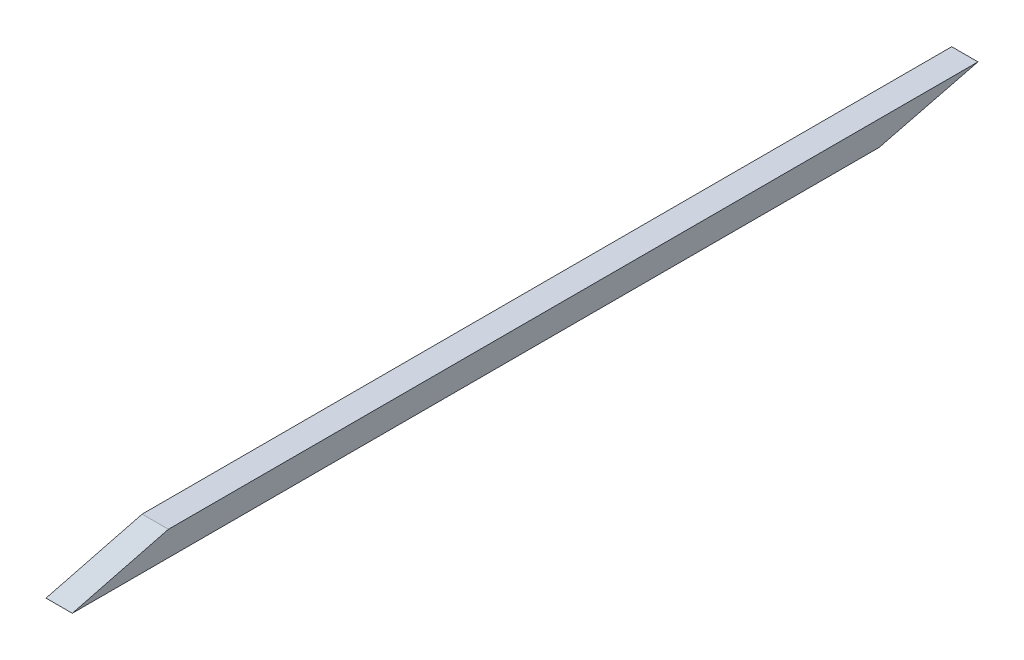
ISO-10303-21;
HEADER;
FILE_DESCRIPTION(('STEP AP214'),'2;1');
FILE_NAME('part.step','',(''),(''),'','','');
FILE_SCHEMA(('AUTOMOTIVE_DESIGN { 1 0 10303 214 1 1 1 1 }'));
ENDSEC;
DATA;
#1=APPLICATION_CONTEXT('core data for automotive mechanical design processes');
#2=APPLICATION_PROTOCOL_DEFINITION('international standard','automotive_design',2000,#1);
#3=PRODUCT_CONTEXT('',#1,'mechanical');
#4=PRODUCT('Part','Part','',(#3));
#5=PRODUCT_RELATED_PRODUCT_CATEGORY('part','',(#4));
#6=PRODUCT_DEFINITION_FORMATION('','',#4);
#7=PRODUCT_DEFINITION_CONTEXT('part definition',#1,'design');
#8=PRODUCT_DEFINITION('design','',#6,#7);
#9=PRODUCT_DEFINITION_SHAPE('','',#8);
#10=(LENGTH_UNIT() NAMED_UNIT(*) SI_UNIT(.MILLI.,.METRE.));
#11=(NAMED_UNIT(*) PLANE_ANGLE_UNIT() SI_UNIT($,.RADIAN.));
#12=(NAMED_UNIT(*) SI_UNIT($,.STERADIAN.) SOLID_ANGLE_UNIT());
#13=UNCERTAINTY_MEASURE_WITH_UNIT(LENGTH_MEASURE(1.E-05),#10,'distance_accuracy_value','');
#14=(GEOMETRIC_REPRESENTATION_CONTEXT(3) GLOBAL_UNCERTAINTY_ASSIGNED_CONTEXT((#13)) GLOBAL_UNIT_ASSIGNED_CONTEXT((#10,
#11,#12)) REPRESENTATION_CONTEXT('',''));
#15=CARTESIAN_POINT('',(0.,0.,0.));
#16=DIRECTION('',(0.,0.,1.));
#17=DIRECTION('',(1.,0.,0.));
#18=AXIS2_PLACEMENT_3D('',#15,#16,#17);
#19=CARTESIAN_POINT('',(-29.1914096505409,29.8295454545454,1724.16));
#20=DIRECTION('',(1.,0.,0.));
#21=DIRECTION('',(0.,1.,0.));
#22=AXIS2_PLACEMENT_3D('',#19,#20,#21);
#23=PLANE('',#22);
#24=DIRECTION('',(0.,0.,-1.));
#25=VECTOR('',#24,1.);
#26=CARTESIAN_POINT('',(-29.1914096505409,-17.1704545454546,1724.16));
#27=LINE('',#26,#25);
#28=CARTESIAN_POINT('',(-29.1914096505409,-17.1704545454546,1724.16));
#29=VERTEX_POINT('',#28);
#30=CARTESIAN_POINT('',(-29.1914096505409,-17.1704545454546,188.196619138496));
#31=VERTEX_POINT('',#30);
#32=EDGE_CURVE('E11',#29,#31,#27,.T.);
#33=ORIENTED_EDGE('',*,*,#32,.F.);
#34=DIRECTION('',(0.,0.248703845911332,-0.968579577024476));
#35=VECTOR('',#34,1.);
#36=CARTESIAN_POINT('',(-29.1914096505409,-17.1704545454546,1724.16));
#37=LINE('',#36,#35);
#38=CARTESIAN_POINT('',(-29.1914096505409,29.8295454545454,1541.11803716529));
#39=VERTEX_POINT('',#38);
#40=EDGE_CURVE('E47',#29,#39,#37,.T.);
#41=ORIENTED_EDGE('',*,*,#40,.T.);
#42=DIRECTION('',(0.,0.,-1.));
#43=VECTOR('',#42,1.);
#44=CARTESIAN_POINT('',(-29.1914096505409,29.8295454545454,1724.16));
#45=LINE('',#44,#43);
#46=CARTESIAN_POINT('',(-29.1914096505409,29.8295454545454,0.));
#47=VERTEX_POINT('',#46);
#48=EDGE_CURVE('E81',#39,#47,#45,.T.);
#49=ORIENTED_EDGE('',*,*,#48,.T.);
#50=DIRECTION('',(0.,-0.242297118329708,0.970202095673432));
#51=VECTOR('',#50,1.);
#52=CARTESIAN_POINT('',(-29.1914096505409,29.8295454545454,0.));
#53=LINE('',#52,#51);
#54=EDGE_CURVE('E102',#47,#31,#53,.T.);
#55=ORIENTED_EDGE('',*,*,#54,.T.);
#56=EDGE_LOOP('',(#33,#41,#49,#55));
#57=FACE_BOUND('',#56,.T.);
#58=ADVANCED_FACE('F33',(#57),#23,.F.);
#59=CARTESIAN_POINT('',(-29.1914096505409,-17.1704545454546,1724.16));
#60=DIRECTION('',(0.,1.,0.));
#61=DIRECTION('',(0.,0.,1.));
#62=AXIS2_PLACEMENT_3D('',#59,#60,#61);
#63=PLANE('',#62);
#64=ORIENTED_EDGE('',*,*,#32,.T.);
#65=DIRECTION('',(1.,0.,0.));
#66=VECTOR('',#65,1.);
#67=CARTESIAN_POINT('',(-29.1914096505409,-17.1704545454546,188.196619138496));
#68=LINE('',#67,#66);
#69=CARTESIAN_POINT('',(20.8085903494591,-17.1704545454545,188.196619138496));
#70=VERTEX_POINT('',#69);
#71=EDGE_CURVE('E100',#31,#70,#68,.T.);
#72=ORIENTED_EDGE('',*,*,#71,.T.);
#73=DIRECTION('',(0.,0.,-1.));
#74=VECTOR('',#73,1.);
#75=CARTESIAN_POINT('',(20.8085903494591,-17.1704545454546,1724.16));
#76=LINE('',#75,#74);
#77=CARTESIAN_POINT('',(20.8085903494591,-17.1704545454546,1724.16));
#78=VERTEX_POINT('',#77);
#79=EDGE_CURVE('E41',#78,#70,#76,.T.);
#80=ORIENTED_EDGE('',*,*,#79,.F.);
#81=DIRECTION('',(1.,0.,0.));
#82=VECTOR('',#81,1.);
#83=CARTESIAN_POINT('',(-29.1914096505409,-17.1704545454546,1724.16));
#84=LINE('',#83,#82);
#85=EDGE_CURVE('E86',#29,#78,#84,.T.);
#86=ORIENTED_EDGE('',*,*,#85,.F.);
#87=EDGE_LOOP('',(#64,#72,#80,#86));
#88=FACE_BOUND('',#87,.T.);
#89=ADVANCED_FACE('F99',(#88),#63,.F.);
#90=CARTESIAN_POINT('',(20.8085903494591,29.8295454545454,1724.16));
#91=DIRECTION('',(-1.,0.,0.));
#92=DIRECTION('',(0.,-1.,0.));
#93=AXIS2_PLACEMENT_3D('',#90,#91,#92);
#94=PLANE('',#93);
#95=DIRECTION('',(0.,0.,-1.));
#96=VECTOR('',#95,1.);
#97=CARTESIAN_POINT('',(20.8085903494591,29.8295454545454,1724.16));
#98=LINE('',#97,#96);
#99=CARTESIAN_POINT('',(20.8085903494591,29.8295454545454,1541.11803716529));
#100=VERTEX_POINT('',#99);
#101=CARTESIAN_POINT('',(20.8085903494591,29.8295454545454,0.));
#102=VERTEX_POINT('',#101);
#103=EDGE_CURVE('E85',#100,#102,#98,.T.);
#104=ORIENTED_EDGE('',*,*,#103,.F.);
#105=DIRECTION('',(0.,0.248703845911332,-0.968579577024476));
#106=VECTOR('',#105,1.);
#107=CARTESIAN_POINT('',(20.8085903494591,-17.1704545454546,1724.16));
#108=LINE('',#107,#106);
#109=EDGE_CURVE('E70',#78,#100,#108,.T.);
#110=ORIENTED_EDGE('',*,*,#109,.F.);
#111=ORIENTED_EDGE('',*,*,#79,.T.);
#112=DIRECTION('',(0.,-0.242297118329708,0.970202095673432));
#113=VECTOR('',#112,1.);
#114=CARTESIAN_POINT('',(20.8085903494591,29.8295454545454,0.));
#115=LINE('',#114,#113);
#116=EDGE_CURVE('E96',#102,#70,#115,.T.);
#117=ORIENTED_EDGE('',*,*,#116,.F.);
#118=EDGE_LOOP('',(#104,#110,#111,#117));
#119=FACE_BOUND('',#118,.T.);
#120=ADVANCED_FACE('F95',(#119),#94,.F.);
#121=CARTESIAN_POINT('',(-29.1914096505409,29.8295454545454,1724.16));
#122=DIRECTION('',(0.,-1.,0.));
#123=DIRECTION('',(0.,0.,-1.));
#124=AXIS2_PLACEMENT_3D('',#121,#122,#123);
#125=PLANE('',#124);
#126=ORIENTED_EDGE('',*,*,#48,.F.);
#127=DIRECTION('',(1.,0.,0.));
#128=VECTOR('',#127,1.);
#129=CARTESIAN_POINT('',(-29.1914096505409,29.8295454545454,1541.11803716529));
#130=LINE('',#129,#128);
#131=EDGE_CURVE('E67',#39,#100,#130,.T.);
#132=ORIENTED_EDGE('',*,*,#131,.T.);
#133=ORIENTED_EDGE('',*,*,#103,.T.);
#134=DIRECTION('',(-1.,0.,0.));
#135=VECTOR('',#134,1.);
#136=CARTESIAN_POINT('',(-29.1914096505409,29.8295454545454,0.));
#137=LINE('',#136,#135);
#138=EDGE_CURVE('E75',#102,#47,#137,.T.);
#139=ORIENTED_EDGE('',*,*,#138,.T.);
#140=EDGE_LOOP('',(#126,#132,#133,#139));
#141=FACE_BOUND('',#140,.T.);
#142=ADVANCED_FACE('F84',(#141),#125,.F.);
#143=CARTESIAN_POINT('',(-29.1914096505409,29.8295454545454,0.));
#144=DIRECTION('',(0.,0.970202095673432,0.242297118329708));
#145=DIRECTION('',(0.,-0.242297118329708,0.970202095673432));
#146=AXIS2_PLACEMENT_3D('',#143,#144,#145);
#147=PLANE('',#146);
#148=ORIENTED_EDGE('',*,*,#116,.T.);
#149=ORIENTED_EDGE('',*,*,#71,.F.);
#150=ORIENTED_EDGE('',*,*,#54,.F.);
#151=ORIENTED_EDGE('',*,*,#138,.F.);
#152=EDGE_LOOP('',(#148,#149,#150,#151));
#153=FACE_BOUND('',#152,.T.);
#154=ADVANCED_FACE('F107',(#153),#147,.F.);
#155=CARTESIAN_POINT('',(-29.1914096505409,-17.1704545454546,1724.16));
#156=DIRECTION('',(0.,-0.968579577024476,-0.248703845911332));
#157=DIRECTION('',(0.,0.248703845911332,-0.968579577024476));
#158=AXIS2_PLACEMENT_3D('',#155,#156,#157);
#159=PLANE('',#158);
#160=ORIENTED_EDGE('',*,*,#109,.T.);
#161=ORIENTED_EDGE('',*,*,#131,.F.);
#162=ORIENTED_EDGE('',*,*,#40,.F.);
#163=ORIENTED_EDGE('',*,*,#85,.T.);
#164=EDGE_LOOP('',(#160,#161,#162,#163));
#165=FACE_BOUND('',#164,.T.);
#166=ADVANCED_FACE('F68',(#165),#159,.F.);
#167=CLOSED_SHELL('',(#58,#89,#120,#142,#154,#166));
#168=MANIFOLD_SOLID_BREP('B2',#167);
#169=ADVANCED_BREP_SHAPE_REPRESENTATION('',(#18,#168),#14);
#170=SHAPE_DEFINITION_REPRESENTATION(#9,#169);
ENDSEC;
END-ISO-10303-21;
